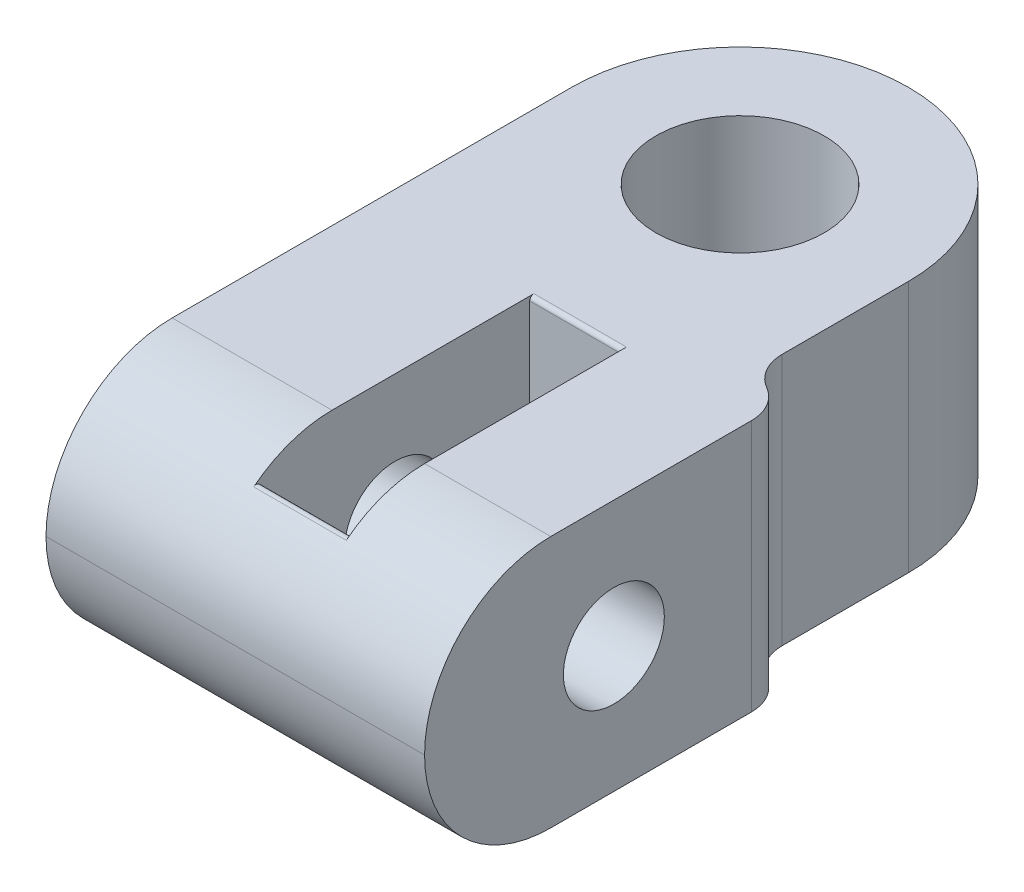
ISO-10303-21;
HEADER;
FILE_DESCRIPTION(('STEP AP214'),'2;1');
FILE_NAME('part.step','',(''),(''),'','','');
FILE_SCHEMA(('AUTOMOTIVE_DESIGN { 1 0 10303 214 1 1 1 1 }'));
ENDSEC;
DATA;
#1=APPLICATION_CONTEXT('core data for automotive mechanical design processes');
#2=APPLICATION_PROTOCOL_DEFINITION('international standard','automotive_design',2000,#1);
#3=PRODUCT_CONTEXT('',#1,'mechanical');
#4=PRODUCT('Part','Part','',(#3));
#5=PRODUCT_RELATED_PRODUCT_CATEGORY('part','',(#4));
#6=PRODUCT_DEFINITION_FORMATION('','',#4);
#7=PRODUCT_DEFINITION_CONTEXT('part definition',#1,'design');
#8=PRODUCT_DEFINITION('design','',#6,#7);
#9=PRODUCT_DEFINITION_SHAPE('','',#8);
#10=(LENGTH_UNIT() NAMED_UNIT(*) SI_UNIT(.MILLI.,.METRE.));
#11=(NAMED_UNIT(*) PLANE_ANGLE_UNIT() SI_UNIT($,.RADIAN.));
#12=(NAMED_UNIT(*) SI_UNIT($,.STERADIAN.) SOLID_ANGLE_UNIT());
#13=UNCERTAINTY_MEASURE_WITH_UNIT(LENGTH_MEASURE(1.E-05),#10,'distance_accuracy_value','');
#14=(GEOMETRIC_REPRESENTATION_CONTEXT(3) GLOBAL_UNCERTAINTY_ASSIGNED_CONTEXT((#13)) GLOBAL_UNIT_ASSIGNED_CONTEXT((#10,
#11,#12)) REPRESENTATION_CONTEXT('',''));
#15=CARTESIAN_POINT('',(0.,0.,0.));
#16=DIRECTION('',(0.,0.,1.));
#17=DIRECTION('',(1.,0.,0.));
#18=AXIS2_PLACEMENT_3D('',#15,#16,#17);
#19=CARTESIAN_POINT('',(-5.08,3.81,10.16));
#20=DIRECTION('',(1.,0.,0.));
#21=DIRECTION('',(0.,0.,-1.));
#22=AXIS2_PLACEMENT_3D('',#19,#20,#21);
#23=CYLINDRICAL_SURFACE('',#22,1.524);
#24=CARTESIAN_POINT('',(2.54,3.81,10.16));
#25=DIRECTION('',(1.,0.,0.));
#26=DIRECTION('',(0.,0.,-1.));
#27=AXIS2_PLACEMENT_3D('',#24,#25,#26);
#28=CIRCLE('',#27,1.524);
#29=CARTESIAN_POINT('',(2.54,3.81,8.636));
#30=VERTEX_POINT('',#29);
#31=EDGE_CURVE('E231',#30,#30,#28,.F.);
#32=ORIENTED_EDGE('',*,*,#31,.T.);
#33=EDGE_LOOP('',(#32));
#34=FACE_BOUND('',#33,.T.);
#35=CARTESIAN_POINT('',(6.35,3.81,10.16));
#36=DIRECTION('',(1.,0.,0.));
#37=DIRECTION('',(0.,0.,-1.));
#38=AXIS2_PLACEMENT_3D('',#35,#36,#37);
#39=CIRCLE('',#38,1.524);
#40=CARTESIAN_POINT('',(6.35,3.81,8.636));
#41=VERTEX_POINT('',#40);
#42=EDGE_CURVE('E372',#41,#41,#39,.T.);
#43=ORIENTED_EDGE('',*,*,#42,.T.);
#44=EDGE_LOOP('',(#43));
#45=FACE_BOUND('',#44,.T.);
#46=ADVANCED_FACE('F42',(#34,#45),#23,.F.);
#47=CARTESIAN_POINT('',(0.,7.62,0.));
#48=DIRECTION('',(0.,-1.,0.));
#49=DIRECTION('',(0.,0.,-1.));
#50=AXIS2_PLACEMENT_3D('',#47,#48,#49);
#51=PLANE('',#50);
#52=DIRECTION('',(0.,0.,1.));
#53=VECTOR('',#52,1.);
#54=CARTESIAN_POINT('',(-0.254000000000001,7.62,14.224));
#55=LINE('',#54,#53);
#56=CARTESIAN_POINT('',(-0.254000000000001,7.62,5.969));
#57=VERTEX_POINT('',#56);
#58=CARTESIAN_POINT('',(-0.254000000000001,7.62,12.065));
#59=VERTEX_POINT('',#58);
#60=EDGE_CURVE('E187',#57,#59,#55,.T.);
#61=ORIENTED_EDGE('',*,*,#60,.F.);
#62=DIRECTION('',(-1.,0.,0.));
#63=VECTOR('',#62,1.);
#64=CARTESIAN_POINT('',(0.,7.62,5.969));
#65=LINE('',#64,#63);
#66=CARTESIAN_POINT('',(2.54,7.62,5.969));
#67=VERTEX_POINT('',#66);
#68=EDGE_CURVE('E266',#57,#67,#65,.F.);
#69=ORIENTED_EDGE('',*,*,#68,.T.);
#70=DIRECTION('',(0.,0.,-1.));
#71=VECTOR('',#70,1.);
#72=CARTESIAN_POINT('',(2.54,7.62,14.224));
#73=LINE('',#72,#71);
#74=CARTESIAN_POINT('',(2.54,7.62,12.065));
#75=VERTEX_POINT('',#74);
#76=EDGE_CURVE('E686',#75,#67,#73,.T.);
#77=ORIENTED_EDGE('',*,*,#76,.F.);
#78=DIRECTION('',(1.,0.,0.));
#79=VECTOR('',#78,1.);
#80=CARTESIAN_POINT('',(0.,7.62,12.065));
#81=LINE('',#80,#79);
#82=CARTESIAN_POINT('',(6.35,7.62,12.065));
#83=VERTEX_POINT('',#82);
#84=EDGE_CURVE('E220',#75,#83,#81,.T.);
#85=ORIENTED_EDGE('',*,*,#84,.T.);
#86=DIRECTION('',(0.,0.,-1.));
#87=VECTOR('',#86,1.);
#88=CARTESIAN_POINT('',(6.35,7.62,5.08));
#89=LINE('',#88,#87);
#90=CARTESIAN_POINT('',(6.35,7.62,6.00970452561247));
#91=VERTEX_POINT('',#90);
#92=EDGE_CURVE('E328',#83,#91,#89,.T.);
#93=ORIENTED_EDGE('',*,*,#92,.T.);
#94=CARTESIAN_POINT('',(5.08,7.62,6.00970452561247));
#95=DIRECTION('',(0.,-1.,0.));
#96=DIRECTION('',(0.,0.,-1.));
#97=AXIS2_PLACEMENT_3D('',#94,#95,#96);
#98=CIRCLE('',#97,1.27);
#99=CARTESIAN_POINT('',(5.715,7.62,4.90985226280623));
#100=VERTEX_POINT('',#99);
#101=EDGE_CURVE('E252',#91,#100,#98,.F.);
#102=ORIENTED_EDGE('',*,*,#101,.T.);
#103=CARTESIAN_POINT('',(6.35,7.62,3.81));
#104=DIRECTION('',(0.,-1.,0.));
#105=DIRECTION('',(0.,0.,-1.));
#106=AXIS2_PLACEMENT_3D('',#103,#104,#105);
#107=CIRCLE('',#106,1.27);
#108=CARTESIAN_POINT('',(5.08,7.62,3.81));
#109=VERTEX_POINT('',#108);
#110=EDGE_CURVE('E239',#100,#109,#107,.T.);
#111=ORIENTED_EDGE('',*,*,#110,.T.);
#112=DIRECTION('',(0.,0.,-1.));
#113=VECTOR('',#112,1.);
#114=CARTESIAN_POINT('',(5.08,7.62,-5.08));
#115=LINE('',#114,#113);
#116=CARTESIAN_POINT('',(5.08,7.62,0.));
#117=VERTEX_POINT('',#116);
#118=EDGE_CURVE('E334',#109,#117,#115,.T.);
#119=ORIENTED_EDGE('',*,*,#118,.T.);
#120=CARTESIAN_POINT('',(0.,7.62,0.));
#121=DIRECTION('',(0.,-1.,0.));
#122=DIRECTION('',(0.,0.,-1.));
#123=AXIS2_PLACEMENT_3D('',#120,#121,#122);
#124=CIRCLE('',#123,5.08);
#125=CARTESIAN_POINT('',(0.,7.62,-5.08));
#126=VERTEX_POINT('',#125);
#127=EDGE_CURVE('E360',#117,#126,#124,.F.);
#128=ORIENTED_EDGE('',*,*,#127,.T.);
#129=CARTESIAN_POINT('',(0.,7.62,0.));
#130=DIRECTION('',(0.,-1.,0.));
#131=DIRECTION('',(0.,0.,-1.));
#132=AXIS2_PLACEMENT_3D('',#129,#130,#131);
#133=CIRCLE('',#132,5.08);
#134=CARTESIAN_POINT('',(-5.08,7.62,0.));
#135=VERTEX_POINT('',#134);
#136=EDGE_CURVE('E323',#126,#135,#133,.F.);
#137=ORIENTED_EDGE('',*,*,#136,.T.);
#138=DIRECTION('',(0.,0.,1.));
#139=VECTOR('',#138,1.);
#140=CARTESIAN_POINT('',(-5.08,7.62,15.875));
#141=LINE('',#140,#139);
#142=CARTESIAN_POINT('',(-5.08,7.62,12.065));
#143=VERTEX_POINT('',#142);
#144=EDGE_CURVE('E321',#135,#143,#141,.T.);
#145=ORIENTED_EDGE('',*,*,#144,.T.);
#146=EDGE_CURVE('E221',#143,#59,#81,.T.);
#147=ORIENTED_EDGE('',*,*,#146,.T.);
#148=EDGE_LOOP('',(#61,#69,#77,#85,#93,#102,#111,#119,#128,#137,#145,#147));
#149=FACE_BOUND('',#148,.T.);
#150=CARTESIAN_POINT('',(0.,7.62,0.));
#151=DIRECTION('',(0.,1.,0.));
#152=DIRECTION('',(0.,0.,1.));
#153=AXIS2_PLACEMENT_3D('',#150,#151,#152);
#154=CIRCLE('',#153,2.54);
#155=CARTESIAN_POINT('',(0.,7.62,2.54));
#156=VERTEX_POINT('',#155);
#157=EDGE_CURVE('E348',#156,#156,#154,.T.);
#158=ORIENTED_EDGE('',*,*,#157,.F.);
#159=EDGE_LOOP('',(#158));
#160=FACE_BOUND('',#159,.T.);
#161=ADVANCED_FACE('F318',(#149,#160),#51,.F.);
#162=CARTESIAN_POINT('',(0.,0.,0.));
#163=DIRECTION('',(0.,-1.,0.));
#164=DIRECTION('',(0.,0.,-1.));
#165=AXIS2_PLACEMENT_3D('',#162,#163,#164);
#166=PLANE('',#165);
#167=DIRECTION('',(-1.,0.,0.));
#168=VECTOR('',#167,1.);
#169=CARTESIAN_POINT('',(-0.254000000000001,0.,5.969));
#170=LINE('',#169,#168);
#171=CARTESIAN_POINT('',(2.54,0.,5.969));
#172=VERTEX_POINT('',#171);
#173=CARTESIAN_POINT('',(-0.254000000000001,0.,5.969));
#174=VERTEX_POINT('',#173);
#175=EDGE_CURVE('E198',#172,#174,#170,.T.);
#176=ORIENTED_EDGE('',*,*,#175,.T.);
#177=DIRECTION('',(0.,0.,1.));
#178=VECTOR('',#177,1.);
#179=CARTESIAN_POINT('',(-0.254000000000001,0.,14.224));
#180=LINE('',#179,#178);
#181=CARTESIAN_POINT('',(-0.254000000000001,0.,12.065));
#182=VERTEX_POINT('',#181);
#183=EDGE_CURVE('E186',#174,#182,#180,.T.);
#184=ORIENTED_EDGE('',*,*,#183,.T.);
#185=DIRECTION('',(1.,0.,0.));
#186=VECTOR('',#185,1.);
#187=CARTESIAN_POINT('',(-5.08,0.,12.065));
#188=LINE('',#187,#186);
#189=CARTESIAN_POINT('',(-5.08,0.,12.065));
#190=VERTEX_POINT('',#189);
#191=EDGE_CURVE('E208',#182,#190,#188,.F.);
#192=ORIENTED_EDGE('',*,*,#191,.T.);
#193=DIRECTION('',(0.,0.,1.));
#194=VECTOR('',#193,1.);
#195=CARTESIAN_POINT('',(-5.08,0.,15.875));
#196=LINE('',#195,#194);
#197=CARTESIAN_POINT('',(-5.08,0.,0.));
#198=VERTEX_POINT('',#197);
#199=EDGE_CURVE('E344',#198,#190,#196,.T.);
#200=ORIENTED_EDGE('',*,*,#199,.F.);
#201=CARTESIAN_POINT('',(0.,0.,0.));
#202=DIRECTION('',(0.,-1.,0.));
#203=DIRECTION('',(0.,0.,-1.));
#204=AXIS2_PLACEMENT_3D('',#201,#202,#203);
#205=CIRCLE('',#204,5.08);
#206=CARTESIAN_POINT('',(0.,0.,-5.08));
#207=VERTEX_POINT('',#206);
#208=EDGE_CURVE('E357',#198,#207,#205,.T.);
#209=ORIENTED_EDGE('',*,*,#208,.T.);
#210=CARTESIAN_POINT('',(0.,0.,0.));
#211=DIRECTION('',(0.,-1.,0.));
#212=DIRECTION('',(0.,0.,-1.));
#213=AXIS2_PLACEMENT_3D('',#210,#211,#212);
#214=CIRCLE('',#213,5.08);
#215=CARTESIAN_POINT('',(5.08,0.,0.));
#216=VERTEX_POINT('',#215);
#217=EDGE_CURVE('E353',#207,#216,#214,.T.);
#218=ORIENTED_EDGE('',*,*,#217,.T.);
#219=DIRECTION('',(0.,0.,-1.));
#220=VECTOR('',#219,1.);
#221=CARTESIAN_POINT('',(5.08,0.,-5.08));
#222=LINE('',#221,#220);
#223=CARTESIAN_POINT('',(5.08,0.,3.81));
#224=VERTEX_POINT('',#223);
#225=EDGE_CURVE('E329',#224,#216,#222,.T.);
#226=ORIENTED_EDGE('',*,*,#225,.F.);
#227=CARTESIAN_POINT('',(6.35,0.,3.81));
#228=DIRECTION('',(0.,-1.,0.));
#229=DIRECTION('',(0.,0.,-1.));
#230=AXIS2_PLACEMENT_3D('',#227,#228,#229);
#231=CIRCLE('',#230,1.27);
#232=CARTESIAN_POINT('',(5.715,0.,4.90985226280623));
#233=VERTEX_POINT('',#232);
#234=EDGE_CURVE('E235',#224,#233,#231,.F.);
#235=ORIENTED_EDGE('',*,*,#234,.T.);
#236=CARTESIAN_POINT('',(5.08,0.,6.00970452561247));
#237=DIRECTION('',(0.,-1.,0.));
#238=DIRECTION('',(0.,0.,-1.));
#239=AXIS2_PLACEMENT_3D('',#236,#237,#238);
#240=CIRCLE('',#239,1.27);
#241=CARTESIAN_POINT('',(6.35,0.,6.00970452561247));
#242=VERTEX_POINT('',#241);
#243=EDGE_CURVE('E246',#233,#242,#240,.T.);
#244=ORIENTED_EDGE('',*,*,#243,.T.);
#245=DIRECTION('',(0.,0.,-1.));
#246=VECTOR('',#245,1.);
#247=CARTESIAN_POINT('',(6.35,0.,5.08));
#248=LINE('',#247,#246);
#249=CARTESIAN_POINT('',(6.35,0.,12.065));
#250=VERTEX_POINT('',#249);
#251=EDGE_CURVE('E205',#250,#242,#248,.T.);
#252=ORIENTED_EDGE('',*,*,#251,.F.);
#253=CARTESIAN_POINT('',(2.54,0.,12.065));
#254=VERTEX_POINT('',#253);
#255=EDGE_CURVE('E193',#250,#254,#188,.F.);
#256=ORIENTED_EDGE('',*,*,#255,.T.);
#257=DIRECTION('',(0.,0.,-1.));
#258=VECTOR('',#257,1.);
#259=CARTESIAN_POINT('',(2.54,0.,14.224));
#260=LINE('',#259,#258);
#261=EDGE_CURVE('E172',#254,#172,#260,.T.);
#262=ORIENTED_EDGE('',*,*,#261,.T.);
#263=EDGE_LOOP('',(#176,#184,#192,#200,#209,#218,#226,#235,#244,#252,#256,#262));
#264=FACE_BOUND('',#263,.T.);
#265=CARTESIAN_POINT('',(0.,0.,0.));
#266=DIRECTION('',(0.,1.,0.));
#267=DIRECTION('',(0.,0.,1.));
#268=AXIS2_PLACEMENT_3D('',#265,#266,#267);
#269=CIRCLE('',#268,2.54);
#270=CARTESIAN_POINT('',(0.,0.,2.54));
#271=VERTEX_POINT('',#270);
#272=EDGE_CURVE('E338',#271,#271,#269,.T.);
#273=ORIENTED_EDGE('',*,*,#272,.T.);
#274=EDGE_LOOP('',(#273));
#275=FACE_BOUND('',#274,.T.);
#276=ADVANCED_FACE('F202',(#264,#275),#166,.T.);
#277=CARTESIAN_POINT('',(-5.08,7.62,15.875));
#278=DIRECTION('',(1.,0.,0.));
#279=DIRECTION('',(0.,0.,-1.));
#280=AXIS2_PLACEMENT_3D('',#277,#278,#279);
#281=PLANE('',#280);
#282=CARTESIAN_POINT('',(-5.08,3.81,10.16));
#283=DIRECTION('',(1.,0.,0.));
#284=DIRECTION('',(0.,0.,-1.));
#285=AXIS2_PLACEMENT_3D('',#282,#283,#284);
#286=CIRCLE('',#285,1.524);
#287=CARTESIAN_POINT('',(-5.08,3.81,8.636));
#288=VERTEX_POINT('',#287);
#289=EDGE_CURVE('E420',#288,#288,#286,.T.);
#290=ORIENTED_EDGE('',*,*,#289,.T.);
#291=EDGE_LOOP('',(#290));
#292=FACE_BOUND('',#291,.T.);
#293=ORIENTED_EDGE('',*,*,#199,.T.);
#294=CARTESIAN_POINT('',(-5.08,3.81,12.065));
#295=DIRECTION('',(1.,0.,0.));
#296=DIRECTION('',(0.,0.,-1.));
#297=AXIS2_PLACEMENT_3D('',#294,#295,#296);
#298=CIRCLE('',#297,3.81);
#299=CARTESIAN_POINT('',(-5.08,3.81,15.875));
#300=VERTEX_POINT('',#299);
#301=EDGE_CURVE('E212',#190,#300,#298,.F.);
#302=ORIENTED_EDGE('',*,*,#301,.T.);
#303=CARTESIAN_POINT('',(-5.08,3.81,12.065));
#304=DIRECTION('',(1.,0.,0.));
#305=DIRECTION('',(0.,0.,-1.));
#306=AXIS2_PLACEMENT_3D('',#303,#304,#305);
#307=CIRCLE('',#306,3.81);
#308=EDGE_CURVE('E207',#300,#143,#307,.F.);
#309=ORIENTED_EDGE('',*,*,#308,.T.);
#310=ORIENTED_EDGE('',*,*,#144,.F.);
#311=DIRECTION('',(0.,-1.,0.));
#312=VECTOR('',#311,1.);
#313=CARTESIAN_POINT('',(-5.08,7.62,0.));
#314=LINE('',#313,#312);
#315=EDGE_CURVE('E343',#135,#198,#314,.T.);
#316=ORIENTED_EDGE('',*,*,#315,.T.);
#317=EDGE_LOOP('',(#293,#302,#309,#310,#316));
#318=FACE_BOUND('',#317,.T.);
#319=ADVANCED_FACE('F383',(#292,#318),#281,.F.);
#320=CARTESIAN_POINT('',(6.35,7.62,5.08));
#321=DIRECTION('',(-1.,0.,0.));
#322=DIRECTION('',(0.,0.,1.));
#323=AXIS2_PLACEMENT_3D('',#320,#321,#322);
#324=PLANE('',#323);
#325=ORIENTED_EDGE('',*,*,#42,.F.);
#326=EDGE_LOOP('',(#325));
#327=FACE_BOUND('',#326,.T.);
#328=ORIENTED_EDGE('',*,*,#251,.T.);
#329=DIRECTION('',(0.,1.,0.));
#330=VECTOR('',#329,1.);
#331=CARTESIAN_POINT('',(6.35,7.62,6.00970452561247));
#332=LINE('',#331,#330);
#333=EDGE_CURVE('E249',#242,#91,#332,.T.);
#334=ORIENTED_EDGE('',*,*,#333,.T.);
#335=ORIENTED_EDGE('',*,*,#92,.F.);
#336=CARTESIAN_POINT('',(6.35,3.81,12.065));
#337=DIRECTION('',(-1.,0.,0.));
#338=DIRECTION('',(0.,0.,1.));
#339=AXIS2_PLACEMENT_3D('',#336,#337,#338);
#340=CIRCLE('',#339,3.81);
#341=CARTESIAN_POINT('',(6.35,3.81,15.875));
#342=VERTEX_POINT('',#341);
#343=EDGE_CURVE('E369',#83,#342,#340,.F.);
#344=ORIENTED_EDGE('',*,*,#343,.T.);
#345=CARTESIAN_POINT('',(6.35,3.81,12.065));
#346=DIRECTION('',(-1.,0.,0.));
#347=DIRECTION('',(0.,0.,1.));
#348=AXIS2_PLACEMENT_3D('',#345,#346,#347);
#349=CIRCLE('',#348,3.81);
#350=EDGE_CURVE('E214',#342,#250,#349,.F.);
#351=ORIENTED_EDGE('',*,*,#350,.T.);
#352=EDGE_LOOP('',(#328,#334,#335,#344,#351));
#353=FACE_BOUND('',#352,.T.);
#354=ADVANCED_FACE('F379',(#327,#353),#324,.F.);
#355=CARTESIAN_POINT('',(5.08,7.62,-5.08));
#356=DIRECTION('',(-1.,0.,0.));
#357=DIRECTION('',(0.,0.,1.));
#358=AXIS2_PLACEMENT_3D('',#355,#356,#357);
#359=PLANE('',#358);
#360=ORIENTED_EDGE('',*,*,#118,.F.);
#361=DIRECTION('',(0.,-1.,0.));
#362=VECTOR('',#361,1.);
#363=CARTESIAN_POINT('',(5.08,0.,3.81));
#364=LINE('',#363,#362);
#365=EDGE_CURVE('E225',#109,#224,#364,.T.);
#366=ORIENTED_EDGE('',*,*,#365,.T.);
#367=ORIENTED_EDGE('',*,*,#225,.T.);
#368=DIRECTION('',(0.,-1.,0.));
#369=VECTOR('',#368,1.);
#370=CARTESIAN_POINT('',(5.08,7.62,0.));
#371=LINE('',#370,#369);
#372=EDGE_CURVE('E365',#216,#117,#371,.F.);
#373=ORIENTED_EDGE('',*,*,#372,.T.);
#374=EDGE_LOOP('',(#360,#366,#367,#373));
#375=FACE_BOUND('',#374,.T.);
#376=ADVANCED_FACE('F437',(#375),#359,.F.);
#377=CARTESIAN_POINT('',(0.,7.62,0.));
#378=DIRECTION('',(0.,-1.,0.));
#379=DIRECTION('',(0.,0.,-1.));
#380=AXIS2_PLACEMENT_3D('',#377,#378,#379);
#381=CYLINDRICAL_SURFACE('',#380,2.54);
#382=ORIENTED_EDGE('',*,*,#157,.T.);
#383=EDGE_LOOP('',(#382));
#384=FACE_BOUND('',#383,.T.);
#385=ORIENTED_EDGE('',*,*,#272,.F.);
#386=EDGE_LOOP('',(#385));
#387=FACE_BOUND('',#386,.T.);
#388=ADVANCED_FACE('F434',(#384,#387),#381,.F.);
#389=CARTESIAN_POINT('',(-0.254000000000001,3.81,10.16));
#390=DIRECTION('',(-1.,0.,0.));
#391=DIRECTION('',(0.,0.,1.));
#392=AXIS2_PLACEMENT_3D('',#389,#390,#391);
#393=CIRCLE('',#392,1.524);
#394=CARTESIAN_POINT('',(-0.254000000000001,3.81,11.684));
#395=VERTEX_POINT('',#394);
#396=EDGE_CURVE('E314',#395,#395,#393,.F.);
#397=ORIENTED_EDGE('',*,*,#396,.T.);
#398=EDGE_LOOP('',(#397));
#399=FACE_BOUND('',#398,.T.);
#400=ORIENTED_EDGE('',*,*,#289,.F.);
#401=EDGE_LOOP('',(#400));
#402=FACE_BOUND('',#401,.T.);
#403=ADVANCED_FACE('F436',(#399,#402),#23,.F.);
#404=CARTESIAN_POINT('',(0.,7.62,0.));
#405=DIRECTION('',(0.,-1.,0.));
#406=DIRECTION('',(0.,0.,-1.));
#407=AXIS2_PLACEMENT_3D('',#404,#405,#406);
#408=CYLINDRICAL_SURFACE('',#407,5.08);
#409=DIRECTION('',(0.,-1.,0.));
#410=VECTOR('',#409,1.);
#411=CARTESIAN_POINT('',(0.,7.62,-5.08));
#412=LINE('',#411,#410);
#413=EDGE_CURVE('E230',#126,#207,#412,.T.);
#414=ORIENTED_EDGE('',*,*,#413,.F.);
#415=ORIENTED_EDGE('',*,*,#127,.F.);
#416=ORIENTED_EDGE('',*,*,#372,.F.);
#417=ORIENTED_EDGE('',*,*,#217,.F.);
#418=EDGE_LOOP('',(#414,#415,#416,#417));
#419=FACE_BOUND('',#418,.T.);
#420=ADVANCED_FACE('F443',(#419),#408,.T.);
#421=CARTESIAN_POINT('',(0.,7.62,0.));
#422=DIRECTION('',(0.,-1.,0.));
#423=DIRECTION('',(0.,0.,-1.));
#424=AXIS2_PLACEMENT_3D('',#421,#422,#423);
#425=CYLINDRICAL_SURFACE('',#424,5.08);
#426=ORIENTED_EDGE('',*,*,#136,.F.);
#427=ORIENTED_EDGE('',*,*,#413,.T.);
#428=ORIENTED_EDGE('',*,*,#208,.F.);
#429=ORIENTED_EDGE('',*,*,#315,.F.);
#430=EDGE_LOOP('',(#426,#427,#428,#429));
#431=FACE_BOUND('',#430,.T.);
#432=ADVANCED_FACE('F582',(#431),#425,.T.);
#433=CARTESIAN_POINT('',(0.,3.81,12.065));
#434=DIRECTION('',(1.,0.,0.));
#435=DIRECTION('',(0.,0.,-1.));
#436=AXIS2_PLACEMENT_3D('',#433,#434,#435);
#437=CYLINDRICAL_SURFACE('',#436,3.81);
#438=CARTESIAN_POINT('',(2.54,3.81,12.065));
#439=DIRECTION('',(1.,0.,0.));
#440=DIRECTION('',(0.,0.,-1.));
#441=AXIS2_PLACEMENT_3D('',#438,#439,#440);
#442=CIRCLE('',#441,3.81);
#443=CARTESIAN_POINT('',(2.54,6.79725467403013,14.4298275862069));
#444=VERTEX_POINT('',#443);
#445=EDGE_CURVE('E58',#444,#75,#442,.F.);
#446=ORIENTED_EDGE('',*,*,#445,.F.);
#447=DIRECTION('',(1.,0.,0.));
#448=VECTOR('',#447,1.);
#449=CARTESIAN_POINT('',(0.,6.79725467403013,14.4298275862069));
#450=LINE('',#449,#448);
#451=CARTESIAN_POINT('',(-0.254000000000001,6.79725467403013,14.4298275862069));
#452=VERTEX_POINT('',#451);
#453=EDGE_CURVE('E280',#444,#452,#450,.F.);
#454=ORIENTED_EDGE('',*,*,#453,.T.);
#455=CARTESIAN_POINT('',(-0.254000000000001,3.81,12.065));
#456=DIRECTION('',(-1.,0.,0.));
#457=DIRECTION('',(0.,0.,1.));
#458=AXIS2_PLACEMENT_3D('',#455,#456,#457);
#459=CIRCLE('',#458,3.81);
#460=EDGE_CURVE('E65',#59,#452,#459,.F.);
#461=ORIENTED_EDGE('',*,*,#460,.F.);
#462=ORIENTED_EDGE('',*,*,#146,.F.);
#463=ORIENTED_EDGE('',*,*,#308,.F.);
#464=DIRECTION('',(1.,0.,0.));
#465=VECTOR('',#464,1.);
#466=CARTESIAN_POINT('',(6.35,3.81,15.875));
#467=LINE('',#466,#465);
#468=EDGE_CURVE('E226',#342,#300,#467,.F.);
#469=ORIENTED_EDGE('',*,*,#468,.F.);
#470=ORIENTED_EDGE('',*,*,#343,.F.);
#471=ORIENTED_EDGE('',*,*,#84,.F.);
#472=EDGE_LOOP('',(#446,#454,#461,#462,#463,#469,#470,#471));
#473=FACE_BOUND('',#472,.T.);
#474=ADVANCED_FACE('F310',(#473),#437,.T.);
#475=CARTESIAN_POINT('',(6.35,3.81,12.065));
#476=DIRECTION('',(-1.,0.,0.));
#477=DIRECTION('',(0.,0.,1.));
#478=AXIS2_PLACEMENT_3D('',#475,#476,#477);
#479=CYLINDRICAL_SURFACE('',#478,3.81);
#480=CARTESIAN_POINT('',(-0.254000000000001,3.81,12.065));
#481=DIRECTION('',(-1.,0.,0.));
#482=DIRECTION('',(0.,0.,1.));
#483=AXIS2_PLACEMENT_3D('',#480,#481,#482);
#484=CIRCLE('',#483,3.81);
#485=CARTESIAN_POINT('',(-0.254000000000001,0.822745325969869,14.4298275862069));
#486=VERTEX_POINT('',#485);
#487=EDGE_CURVE('E199',#486,#182,#484,.F.);
#488=ORIENTED_EDGE('',*,*,#487,.F.);
#489=DIRECTION('',(-1.,0.,0.));
#490=VECTOR('',#489,1.);
#491=CARTESIAN_POINT('',(6.35,0.822745325969869,14.4298275862069));
#492=LINE('',#491,#490);
#493=CARTESIAN_POINT('',(2.54,0.822745325969869,14.4298275862069));
#494=VERTEX_POINT('',#493);
#495=EDGE_CURVE('E195',#486,#494,#492,.F.);
#496=ORIENTED_EDGE('',*,*,#495,.T.);
#497=CARTESIAN_POINT('',(2.54,3.81,12.065));
#498=DIRECTION('',(1.,0.,0.));
#499=DIRECTION('',(0.,0.,-1.));
#500=AXIS2_PLACEMENT_3D('',#497,#498,#499);
#501=CIRCLE('',#500,3.81);
#502=EDGE_CURVE('E176',#254,#494,#501,.F.);
#503=ORIENTED_EDGE('',*,*,#502,.F.);
#504=ORIENTED_EDGE('',*,*,#255,.F.);
#505=ORIENTED_EDGE('',*,*,#350,.F.);
#506=ORIENTED_EDGE('',*,*,#468,.T.);
#507=ORIENTED_EDGE('',*,*,#301,.F.);
#508=ORIENTED_EDGE('',*,*,#191,.F.);
#509=EDGE_LOOP('',(#488,#496,#503,#504,#505,#506,#507,#508));
#510=FACE_BOUND('',#509,.T.);
#511=ADVANCED_FACE('F191',(#510),#479,.T.);
#512=CARTESIAN_POINT('',(6.35,7.62,3.81));
#513=DIRECTION('',(0.,1.,0.));
#514=DIRECTION('',(0.,0.,1.));
#515=AXIS2_PLACEMENT_3D('',#512,#513,#514);
#516=CYLINDRICAL_SURFACE('',#515,1.27);
#517=ORIENTED_EDGE('',*,*,#110,.F.);
#518=DIRECTION('',(0.,1.,0.));
#519=VECTOR('',#518,1.);
#520=CARTESIAN_POINT('',(5.715,7.62,4.90985226280623));
#521=LINE('',#520,#519);
#522=EDGE_CURVE('E242',#100,#233,#521,.F.);
#523=ORIENTED_EDGE('',*,*,#522,.T.);
#524=ORIENTED_EDGE('',*,*,#234,.F.);
#525=ORIENTED_EDGE('',*,*,#365,.F.);
#526=EDGE_LOOP('',(#517,#523,#524,#525));
#527=FACE_BOUND('',#526,.T.);
#528=ADVANCED_FACE('F552',(#527),#516,.F.);
#529=CARTESIAN_POINT('',(5.08,7.62,6.00970452561247));
#530=DIRECTION('',(0.,1.,0.));
#531=DIRECTION('',(0.,0.,1.));
#532=AXIS2_PLACEMENT_3D('',#529,#530,#531);
#533=CYLINDRICAL_SURFACE('',#532,1.27);
#534=ORIENTED_EDGE('',*,*,#101,.F.);
#535=ORIENTED_EDGE('',*,*,#333,.F.);
#536=ORIENTED_EDGE('',*,*,#243,.F.);
#537=ORIENTED_EDGE('',*,*,#522,.F.);
#538=EDGE_LOOP('',(#534,#535,#536,#537));
#539=FACE_BOUND('',#538,.T.);
#540=ADVANCED_FACE('F458',(#539),#533,.T.);
#541=CARTESIAN_POINT('',(2.54,0.,14.224));
#542=DIRECTION('',(1.,0.,0.));
#543=DIRECTION('',(0.,0.,-1.));
#544=AXIS2_PLACEMENT_3D('',#541,#542,#543);
#545=PLANE('',#544);
#546=ORIENTED_EDGE('',*,*,#445,.T.);
#547=ORIENTED_EDGE('',*,*,#76,.T.);
#548=CARTESIAN_POINT('',(2.54,7.493,5.969));
#549=DIRECTION('',(1.,0.,0.));
#550=DIRECTION('',(0.,0.,-1.));
#551=AXIS2_PLACEMENT_3D('',#548,#549,#550);
#552=CIRCLE('',#551,0.127);
#553=CARTESIAN_POINT('',(2.54,7.493,6.096));
#554=VERTEX_POINT('',#553);
#555=EDGE_CURVE('E292',#67,#554,#552,.T.);
#556=ORIENTED_EDGE('',*,*,#555,.T.);
#557=DIRECTION('',(0.,1.,0.));
#558=VECTOR('',#557,1.);
#559=CARTESIAN_POINT('',(2.54,0.,6.096));
#560=LINE('',#559,#558);
#561=CARTESIAN_POINT('',(2.54,0.127,6.096));
#562=VERTEX_POINT('',#561);
#563=EDGE_CURVE('E408',#562,#554,#560,.T.);
#564=ORIENTED_EDGE('',*,*,#563,.F.);
#565=CARTESIAN_POINT('',(2.54,0.127,5.969));
#566=DIRECTION('',(1.,0.,0.));
#567=DIRECTION('',(0.,0.,-1.));
#568=AXIS2_PLACEMENT_3D('',#565,#566,#567);
#569=CIRCLE('',#568,0.127);
#570=EDGE_CURVE('E180',#562,#172,#569,.T.);
#571=ORIENTED_EDGE('',*,*,#570,.T.);
#572=ORIENTED_EDGE('',*,*,#261,.F.);
#573=ORIENTED_EDGE('',*,*,#502,.T.);
#574=CARTESIAN_POINT('',(2.54,0.922320481770874,14.351));
#575=DIRECTION('',(1.,0.,0.));
#576=DIRECTION('',(0.,0.,-1.));
#577=AXIS2_PLACEMENT_3D('',#574,#575,#576);
#578=CIRCLE('',#577,0.127);
#579=CARTESIAN_POINT('',(2.54,0.922320481770874,14.224));
#580=VERTEX_POINT('',#579);
#581=EDGE_CURVE('E299',#494,#580,#578,.T.);
#582=ORIENTED_EDGE('',*,*,#581,.T.);
#583=DIRECTION('',(0.,1.,0.));
#584=VECTOR('',#583,1.);
#585=CARTESIAN_POINT('',(2.54,0.,14.224));
#586=LINE('',#585,#584);
#587=CARTESIAN_POINT('',(2.54,6.69767951822913,14.224));
#588=VERTEX_POINT('',#587);
#589=EDGE_CURVE('E306',#580,#588,#586,.T.);
#590=ORIENTED_EDGE('',*,*,#589,.T.);
#591=CARTESIAN_POINT('',(2.54,6.69767951822913,14.351));
#592=DIRECTION('',(1.,0.,0.));
#593=DIRECTION('',(0.,0.,-1.));
#594=AXIS2_PLACEMENT_3D('',#591,#592,#593);
#595=CIRCLE('',#594,0.127);
#596=EDGE_CURVE('E51',#588,#444,#595,.T.);
#597=ORIENTED_EDGE('',*,*,#596,.T.);
#598=EDGE_LOOP('',(#546,#547,#556,#564,#571,#572,#573,#582,#590,#597));
#599=FACE_BOUND('',#598,.T.);
#600=ORIENTED_EDGE('',*,*,#31,.F.);
#601=EDGE_LOOP('',(#600));
#602=FACE_BOUND('',#601,.T.);
#603=ADVANCED_FACE('F174',(#599,#602),#545,.F.);
#604=CARTESIAN_POINT('',(-0.254000000000001,0.,14.224));
#605=DIRECTION('',(-1.,0.,0.));
#606=DIRECTION('',(0.,0.,1.));
#607=AXIS2_PLACEMENT_3D('',#604,#605,#606);
#608=PLANE('',#607);
#609=ORIENTED_EDGE('',*,*,#460,.T.);
#610=CARTESIAN_POINT('',(-0.254000000000001,6.69767951822913,14.351));
#611=DIRECTION('',(-1.,0.,0.));
#612=DIRECTION('',(0.,0.,1.));
#613=AXIS2_PLACEMENT_3D('',#610,#611,#612);
#614=CIRCLE('',#613,0.127);
#615=CARTESIAN_POINT('',(-0.254000000000001,6.69767951822913,14.224));
#616=VERTEX_POINT('',#615);
#617=EDGE_CURVE('E11',#452,#616,#614,.T.);
#618=ORIENTED_EDGE('',*,*,#617,.T.);
#619=DIRECTION('',(0.,1.,0.));
#620=VECTOR('',#619,1.);
#621=CARTESIAN_POINT('',(-0.254000000000001,0.,14.224));
#622=LINE('',#621,#620);
#623=CARTESIAN_POINT('',(-0.254000000000001,0.922320481770874,14.224));
#624=VERTEX_POINT('',#623);
#625=EDGE_CURVE('E391',#624,#616,#622,.T.);
#626=ORIENTED_EDGE('',*,*,#625,.F.);
#627=CARTESIAN_POINT('',(-0.254000000000001,0.922320481770874,14.351));
#628=DIRECTION('',(-1.,0.,0.));
#629=DIRECTION('',(0.,0.,1.));
#630=AXIS2_PLACEMENT_3D('',#627,#628,#629);
#631=CIRCLE('',#630,0.127);
#632=EDGE_CURVE('E295',#624,#486,#631,.T.);
#633=ORIENTED_EDGE('',*,*,#632,.T.);
#634=ORIENTED_EDGE('',*,*,#487,.T.);
#635=ORIENTED_EDGE('',*,*,#183,.F.);
#636=CARTESIAN_POINT('',(-0.254000000000001,0.127,5.969));
#637=DIRECTION('',(-1.,0.,0.));
#638=DIRECTION('',(0.,0.,1.));
#639=AXIS2_PLACEMENT_3D('',#636,#637,#638);
#640=CIRCLE('',#639,0.127);
#641=CARTESIAN_POINT('',(-0.254000000000001,0.127,6.096));
#642=VERTEX_POINT('',#641);
#643=EDGE_CURVE('E283',#174,#642,#640,.T.);
#644=ORIENTED_EDGE('',*,*,#643,.T.);
#645=DIRECTION('',(0.,1.,0.));
#646=VECTOR('',#645,1.);
#647=CARTESIAN_POINT('',(-0.254000000000001,0.,6.096));
#648=LINE('',#647,#646);
#649=CARTESIAN_POINT('',(-0.254000000000001,7.493,6.096));
#650=VERTEX_POINT('',#649);
#651=EDGE_CURVE('E400',#642,#650,#648,.T.);
#652=ORIENTED_EDGE('',*,*,#651,.T.);
#653=CARTESIAN_POINT('',(-0.254000000000001,7.493,5.969));
#654=DIRECTION('',(-1.,0.,0.));
#655=DIRECTION('',(0.,0.,1.));
#656=AXIS2_PLACEMENT_3D('',#653,#654,#655);
#657=CIRCLE('',#656,0.127);
#658=EDGE_CURVE('E288',#650,#57,#657,.T.);
#659=ORIENTED_EDGE('',*,*,#658,.T.);
#660=ORIENTED_EDGE('',*,*,#60,.T.);
#661=EDGE_LOOP('',(#609,#618,#626,#633,#634,#635,#644,#652,#659,#660));
#662=FACE_BOUND('',#661,.T.);
#663=ORIENTED_EDGE('',*,*,#396,.F.);
#664=EDGE_LOOP('',(#663));
#665=FACE_BOUND('',#664,.T.);
#666=ADVANCED_FACE('F388',(#662,#665),#608,.F.);
#667=CARTESIAN_POINT('',(-0.254000000000001,0.,14.224));
#668=DIRECTION('',(0.,0.,1.));
#669=DIRECTION('',(1.,0.,0.));
#670=AXIS2_PLACEMENT_3D('',#667,#668,#669);
#671=PLANE('',#670);
#672=ORIENTED_EDGE('',*,*,#589,.F.);
#673=DIRECTION('',(1.,0.,0.));
#674=VECTOR('',#673,1.);
#675=CARTESIAN_POINT('',(-0.254000000000001,0.922320481770874,14.224));
#676=LINE('',#675,#674);
#677=EDGE_CURVE('E274',#580,#624,#676,.F.);
#678=ORIENTED_EDGE('',*,*,#677,.T.);
#679=ORIENTED_EDGE('',*,*,#625,.T.);
#680=DIRECTION('',(-1.,0.,0.));
#681=VECTOR('',#680,1.);
#682=CARTESIAN_POINT('',(2.54,6.69767951822913,14.224));
#683=LINE('',#682,#681);
#684=EDGE_CURVE('E270',#616,#588,#683,.F.);
#685=ORIENTED_EDGE('',*,*,#684,.T.);
#686=EDGE_LOOP('',(#672,#678,#679,#685));
#687=FACE_BOUND('',#686,.T.);
#688=ADVANCED_FACE('F396',(#687),#671,.F.);
#689=CARTESIAN_POINT('',(-0.254000000000001,0.,6.096));
#690=DIRECTION('',(0.,0.,-1.));
#691=DIRECTION('',(-1.,0.,0.));
#692=AXIS2_PLACEMENT_3D('',#689,#690,#691);
#693=PLANE('',#692);
#694=ORIENTED_EDGE('',*,*,#651,.F.);
#695=DIRECTION('',(-1.,0.,0.));
#696=VECTOR('',#695,1.);
#697=CARTESIAN_POINT('',(2.54,0.127,6.096));
#698=LINE('',#697,#696);
#699=EDGE_CURVE('E263',#642,#562,#698,.F.);
#700=ORIENTED_EDGE('',*,*,#699,.T.);
#701=ORIENTED_EDGE('',*,*,#563,.T.);
#702=DIRECTION('',(-1.,0.,0.));
#703=VECTOR('',#702,1.);
#704=CARTESIAN_POINT('',(-0.254000000000001,7.493,6.096));
#705=LINE('',#704,#703);
#706=EDGE_CURVE('E259',#554,#650,#705,.T.);
#707=ORIENTED_EDGE('',*,*,#706,.T.);
#708=EDGE_LOOP('',(#694,#700,#701,#707));
#709=FACE_BOUND('',#708,.T.);
#710=ADVANCED_FACE('F459',(#709),#693,.F.);
#711=CARTESIAN_POINT('',(0.,0.127,5.969));
#712=DIRECTION('',(1.,0.,0.));
#713=DIRECTION('',(0.,0.,-1.));
#714=AXIS2_PLACEMENT_3D('',#711,#712,#713);
#715=CYLINDRICAL_SURFACE('',#714,0.127);
#716=ORIENTED_EDGE('',*,*,#570,.F.);
#717=ORIENTED_EDGE('',*,*,#699,.F.);
#718=ORIENTED_EDGE('',*,*,#643,.F.);
#719=ORIENTED_EDGE('',*,*,#175,.F.);
#720=EDGE_LOOP('',(#716,#717,#718,#719));
#721=FACE_BOUND('',#720,.T.);
#722=ADVANCED_FACE('F462',(#721),#715,.T.);
#723=CARTESIAN_POINT('',(-0.254000000000001,7.493,5.969));
#724=DIRECTION('',(-1.,0.,0.));
#725=DIRECTION('',(0.,0.,1.));
#726=AXIS2_PLACEMENT_3D('',#723,#724,#725);
#727=CYLINDRICAL_SURFACE('',#726,0.127);
#728=ORIENTED_EDGE('',*,*,#555,.F.);
#729=ORIENTED_EDGE('',*,*,#68,.F.);
#730=ORIENTED_EDGE('',*,*,#658,.F.);
#731=ORIENTED_EDGE('',*,*,#706,.F.);
#732=EDGE_LOOP('',(#728,#729,#730,#731));
#733=FACE_BOUND('',#732,.T.);
#734=ADVANCED_FACE('F481',(#733),#727,.T.);
#735=CARTESIAN_POINT('',(6.35,0.922320481770874,14.351));
#736=DIRECTION('',(-1.,0.,0.));
#737=DIRECTION('',(0.,0.,1.));
#738=AXIS2_PLACEMENT_3D('',#735,#736,#737);
#739=CYLINDRICAL_SURFACE('',#738,0.127);
#740=ORIENTED_EDGE('',*,*,#581,.F.);
#741=ORIENTED_EDGE('',*,*,#495,.F.);
#742=ORIENTED_EDGE('',*,*,#632,.F.);
#743=ORIENTED_EDGE('',*,*,#677,.F.);
#744=EDGE_LOOP('',(#740,#741,#742,#743));
#745=FACE_BOUND('',#744,.T.);
#746=ADVANCED_FACE('F394',(#745),#739,.T.);
#747=CARTESIAN_POINT('',(0.,6.69767951822913,14.351));
#748=DIRECTION('',(1.,0.,0.));
#749=DIRECTION('',(0.,0.,-1.));
#750=AXIS2_PLACEMENT_3D('',#747,#748,#749);
#751=CYLINDRICAL_SURFACE('',#750,0.127);
#752=ORIENTED_EDGE('',*,*,#617,.F.);
#753=ORIENTED_EDGE('',*,*,#453,.F.);
#754=ORIENTED_EDGE('',*,*,#596,.F.);
#755=ORIENTED_EDGE('',*,*,#684,.F.);
#756=EDGE_LOOP('',(#752,#753,#754,#755));
#757=FACE_BOUND('',#756,.T.);
#758=ADVANCED_FACE('F44',(#757),#751,.T.);
#759=CLOSED_SHELL('',(#46,#161,#276,#319,#354,#376,#388,#403,#420,#432,#474,#511,#528,#540,#603,
#666,#688,#710,#722,#734,#746,#758));
#760=MANIFOLD_SOLID_BREP('B2',#759);
#761=ADVANCED_BREP_SHAPE_REPRESENTATION('',(#18,#760),#14);
#762=SHAPE_DEFINITION_REPRESENTATION(#9,#761);
ENDSEC;
END-ISO-10303-21;
